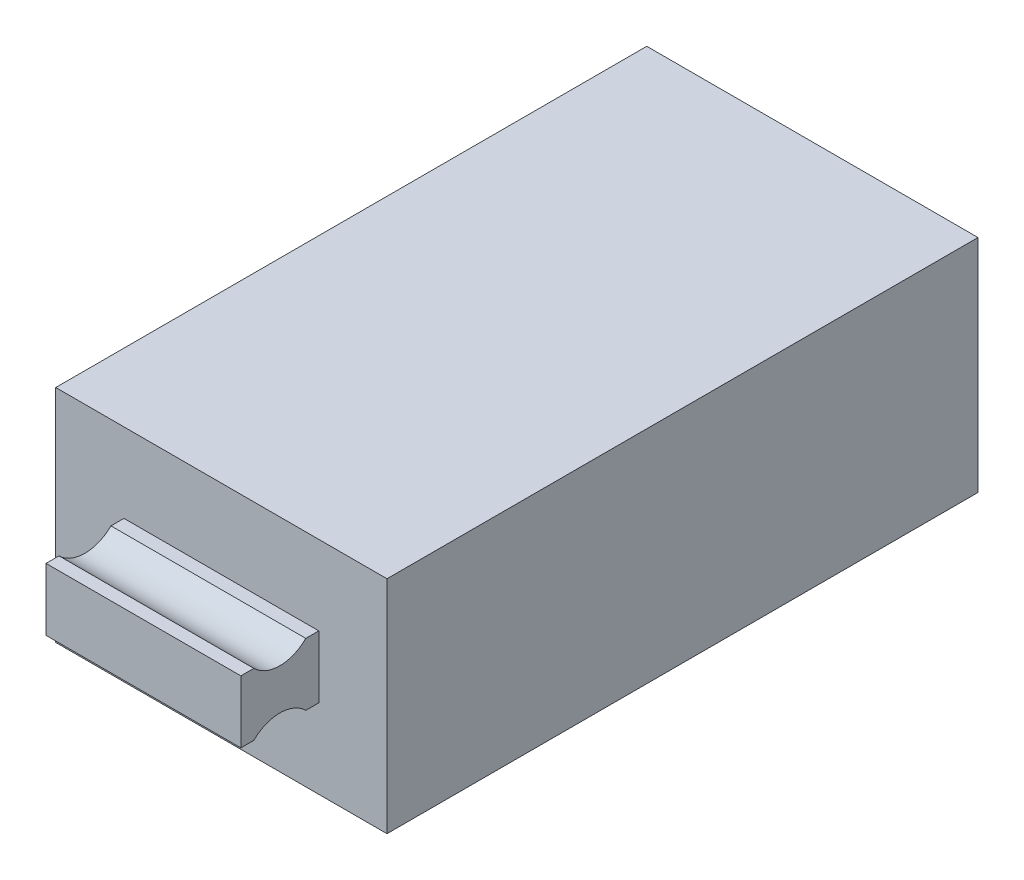
ISO-10303-21;
HEADER;
FILE_DESCRIPTION(('STEP AP214'),'2;1');
FILE_NAME('part.step','',(''),(''),'','','');
FILE_SCHEMA(('AUTOMOTIVE_DESIGN { 1 0 10303 214 1 1 1 1 }'));
ENDSEC;
DATA;
#1=APPLICATION_CONTEXT('core data for automotive mechanical design processes');
#2=APPLICATION_PROTOCOL_DEFINITION('international standard','automotive_design',2000,#1);
#3=PRODUCT_CONTEXT('',#1,'mechanical');
#4=PRODUCT('Part','Part','',(#3));
#5=PRODUCT_RELATED_PRODUCT_CATEGORY('part','',(#4));
#6=PRODUCT_DEFINITION_FORMATION('','',#4);
#7=PRODUCT_DEFINITION_CONTEXT('part definition',#1,'design');
#8=PRODUCT_DEFINITION('design','',#6,#7);
#9=PRODUCT_DEFINITION_SHAPE('','',#8);
#10=(LENGTH_UNIT() NAMED_UNIT(*) SI_UNIT(.MILLI.,.METRE.));
#11=(NAMED_UNIT(*) PLANE_ANGLE_UNIT() SI_UNIT($,.RADIAN.));
#12=(NAMED_UNIT(*) SI_UNIT($,.STERADIAN.) SOLID_ANGLE_UNIT());
#13=UNCERTAINTY_MEASURE_WITH_UNIT(LENGTH_MEASURE(1.E-05),#10,'distance_accuracy_value','');
#14=(GEOMETRIC_REPRESENTATION_CONTEXT(3) GLOBAL_UNCERTAINTY_ASSIGNED_CONTEXT((#13)) GLOBAL_UNIT_ASSIGNED_CONTEXT((#10,
#11,#12)) REPRESENTATION_CONTEXT('',''));
#15=CARTESIAN_POINT('',(0.,0.,0.));
#16=DIRECTION('',(0.,0.,1.));
#17=DIRECTION('',(1.,0.,0.));
#18=AXIS2_PLACEMENT_3D('',#15,#16,#17);
#19=CARTESIAN_POINT('',(0.,0.,91.));
#20=DIRECTION('',(0.,0.,1.));
#21=DIRECTION('',(1.,0.,0.));
#22=AXIS2_PLACEMENT_3D('',#19,#20,#21);
#23=PLANE('',#22);
#24=DIRECTION('',(0.,-1.,0.));
#25=VECTOR('',#24,1.);
#26=CARTESIAN_POINT('',(0.,0.,91.));
#27=LINE('',#26,#25);
#28=CARTESIAN_POINT('',(0.,0.,91.));
#29=VERTEX_POINT('',#28);
#30=CARTESIAN_POINT('',(0.,-34.,91.));
#31=VERTEX_POINT('',#30);
#32=EDGE_CURVE('E196',#29,#31,#27,.T.);
#33=ORIENTED_EDGE('',*,*,#32,.T.);
#34=DIRECTION('',(1.,0.,0.));
#35=VECTOR('',#34,1.);
#36=CARTESIAN_POINT('',(0.,-34.,91.));
#37=LINE('',#36,#35);
#38=CARTESIAN_POINT('',(51.,-34.,91.));
#39=VERTEX_POINT('',#38);
#40=EDGE_CURVE('E83',#31,#39,#37,.T.);
#41=ORIENTED_EDGE('',*,*,#40,.T.);
#42=DIRECTION('',(0.,1.,0.));
#43=VECTOR('',#42,1.);
#44=CARTESIAN_POINT('',(51.,0.,91.));
#45=LINE('',#44,#43);
#46=CARTESIAN_POINT('',(51.,0.,91.));
#47=VERTEX_POINT('',#46);
#48=EDGE_CURVE('E199',#39,#47,#45,.T.);
#49=ORIENTED_EDGE('',*,*,#48,.T.);
#50=DIRECTION('',(-1.,0.,0.));
#51=VECTOR('',#50,1.);
#52=CARTESIAN_POINT('',(0.,0.,91.));
#53=LINE('',#52,#51);
#54=EDGE_CURVE('E52',#47,#29,#53,.T.);
#55=ORIENTED_EDGE('',*,*,#54,.T.);
#56=EDGE_LOOP('',(#33,#41,#49,#55));
#57=FACE_BOUND('',#56,.T.);
#58=DIRECTION('',(-1.,0.,0.));
#59=VECTOR('',#58,1.);
#60=CARTESIAN_POINT('',(52.634249049694,-21.8,91.));
#61=LINE('',#60,#59);
#62=CARTESIAN_POINT('',(40.5,-21.8,91.));
#63=VERTEX_POINT('',#62);
#64=CARTESIAN_POINT('',(10.5,-21.8,91.));
#65=VERTEX_POINT('',#64);
#66=EDGE_CURVE('E153',#63,#65,#61,.T.);
#67=ORIENTED_EDGE('',*,*,#66,.T.);
#68=DIRECTION('',(0.,-1.,0.));
#69=VECTOR('',#68,1.);
#70=CARTESIAN_POINT('',(10.5,-14.,91.));
#71=LINE('',#70,#69);
#72=CARTESIAN_POINT('',(10.5,-12.2,91.));
#73=VERTEX_POINT('',#72);
#74=EDGE_CURVE('E134',#73,#65,#71,.T.);
#75=ORIENTED_EDGE('',*,*,#74,.F.);
#76=DIRECTION('',(-1.,0.,0.));
#77=VECTOR('',#76,1.);
#78=CARTESIAN_POINT('',(52.634249049694,-12.2,91.));
#79=LINE('',#78,#77);
#80=CARTESIAN_POINT('',(40.5,-12.2,91.));
#81=VERTEX_POINT('',#80);
#82=EDGE_CURVE('E172',#81,#73,#79,.T.);
#83=ORIENTED_EDGE('',*,*,#82,.F.);
#84=DIRECTION('',(0.,1.,0.));
#85=VECTOR('',#84,1.);
#86=CARTESIAN_POINT('',(40.5,-14.,91.));
#87=LINE('',#86,#85);
#88=EDGE_CURVE('E146',#63,#81,#87,.T.);
#89=ORIENTED_EDGE('',*,*,#88,.F.);
#90=EDGE_LOOP('',(#67,#75,#83,#89));
#91=FACE_BOUND('',#90,.T.);
#92=ADVANCED_FACE('F35',(#57,#91),#23,.T.);
#93=CARTESIAN_POINT('',(0.,0.,91.));
#94=DIRECTION('',(1.,0.,0.));
#95=DIRECTION('',(0.,1.,0.));
#96=AXIS2_PLACEMENT_3D('',#93,#94,#95);
#97=PLANE('',#96);
#98=DIRECTION('',(0.,-1.,0.));
#99=VECTOR('',#98,1.);
#100=CARTESIAN_POINT('',(0.,0.,0.));
#101=LINE('',#100,#99);
#102=CARTESIAN_POINT('',(0.,0.,0.));
#103=VERTEX_POINT('',#102);
#104=CARTESIAN_POINT('',(0.,-34.,0.));
#105=VERTEX_POINT('',#104);
#106=EDGE_CURVE('E193',#103,#105,#101,.T.);
#107=ORIENTED_EDGE('',*,*,#106,.T.);
#108=DIRECTION('',(0.,0.,-1.));
#109=VECTOR('',#108,1.);
#110=CARTESIAN_POINT('',(0.,-34.,91.));
#111=LINE('',#110,#109);
#112=EDGE_CURVE('E11',#31,#105,#111,.T.);
#113=ORIENTED_EDGE('',*,*,#112,.F.);
#114=ORIENTED_EDGE('',*,*,#32,.F.);
#115=DIRECTION('',(0.,0.,-1.));
#116=VECTOR('',#115,1.);
#117=CARTESIAN_POINT('',(0.,0.,91.));
#118=LINE('',#117,#116);
#119=EDGE_CURVE('E202',#29,#103,#118,.T.);
#120=ORIENTED_EDGE('',*,*,#119,.T.);
#121=EDGE_LOOP('',(#107,#113,#114,#120));
#122=FACE_BOUND('',#121,.T.);
#123=ADVANCED_FACE('F37',(#122),#97,.F.);
#124=CARTESIAN_POINT('',(0.,-34.,91.));
#125=DIRECTION('',(0.,1.,0.));
#126=DIRECTION('',(0.,0.,1.));
#127=AXIS2_PLACEMENT_3D('',#124,#125,#126);
#128=PLANE('',#127);
#129=DIRECTION('',(1.,0.,0.));
#130=VECTOR('',#129,1.);
#131=CARTESIAN_POINT('',(0.,-34.,0.));
#132=LINE('',#131,#130);
#133=CARTESIAN_POINT('',(51.,-34.,0.));
#134=VERTEX_POINT('',#133);
#135=EDGE_CURVE('E205',#105,#134,#132,.T.);
#136=ORIENTED_EDGE('',*,*,#135,.T.);
#137=DIRECTION('',(0.,0.,-1.));
#138=VECTOR('',#137,1.);
#139=CARTESIAN_POINT('',(51.,-34.,91.));
#140=LINE('',#139,#138);
#141=EDGE_CURVE('E44',#39,#134,#140,.T.);
#142=ORIENTED_EDGE('',*,*,#141,.F.);
#143=ORIENTED_EDGE('',*,*,#40,.F.);
#144=ORIENTED_EDGE('',*,*,#112,.T.);
#145=EDGE_LOOP('',(#136,#142,#143,#144));
#146=FACE_BOUND('',#145,.T.);
#147=ADVANCED_FACE('F227',(#146),#128,.F.);
#148=CARTESIAN_POINT('',(51.,0.,91.));
#149=DIRECTION('',(-1.,0.,0.));
#150=DIRECTION('',(0.,-1.,0.));
#151=AXIS2_PLACEMENT_3D('',#148,#149,#150);
#152=PLANE('',#151);
#153=DIRECTION('',(0.,1.,0.));
#154=VECTOR('',#153,1.);
#155=CARTESIAN_POINT('',(51.,0.,0.));
#156=LINE('',#155,#154);
#157=CARTESIAN_POINT('',(51.,0.,0.));
#158=VERTEX_POINT('',#157);
#159=EDGE_CURVE('E70',#134,#158,#156,.T.);
#160=ORIENTED_EDGE('',*,*,#159,.T.);
#161=DIRECTION('',(0.,0.,-1.));
#162=VECTOR('',#161,1.);
#163=CARTESIAN_POINT('',(51.,0.,91.));
#164=LINE('',#163,#162);
#165=EDGE_CURVE('E210',#47,#158,#164,.T.);
#166=ORIENTED_EDGE('',*,*,#165,.F.);
#167=ORIENTED_EDGE('',*,*,#48,.F.);
#168=ORIENTED_EDGE('',*,*,#141,.T.);
#169=EDGE_LOOP('',(#160,#166,#167,#168));
#170=FACE_BOUND('',#169,.T.);
#171=ADVANCED_FACE('F212',(#170),#152,.F.);
#172=CARTESIAN_POINT('',(0.,0.,91.));
#173=DIRECTION('',(0.,-1.,0.));
#174=DIRECTION('',(0.,0.,-1.));
#175=AXIS2_PLACEMENT_3D('',#172,#173,#174);
#176=PLANE('',#175);
#177=DIRECTION('',(-1.,0.,0.));
#178=VECTOR('',#177,1.);
#179=CARTESIAN_POINT('',(0.,0.,0.));
#180=LINE('',#179,#178);
#181=EDGE_CURVE('E76',#158,#103,#180,.T.);
#182=ORIENTED_EDGE('',*,*,#181,.T.);
#183=ORIENTED_EDGE('',*,*,#119,.F.);
#184=ORIENTED_EDGE('',*,*,#54,.F.);
#185=ORIENTED_EDGE('',*,*,#165,.T.);
#186=EDGE_LOOP('',(#182,#183,#184,#185));
#187=FACE_BOUND('',#186,.T.);
#188=ADVANCED_FACE('F219',(#187),#176,.F.);
#189=CARTESIAN_POINT('',(0.,0.,0.));
#190=DIRECTION('',(0.,0.,1.));
#191=DIRECTION('',(1.,0.,0.));
#192=AXIS2_PLACEMENT_3D('',#189,#190,#191);
#193=PLANE('',#192);
#194=ORIENTED_EDGE('',*,*,#106,.F.);
#195=ORIENTED_EDGE('',*,*,#181,.F.);
#196=ORIENTED_EDGE('',*,*,#159,.F.);
#197=ORIENTED_EDGE('',*,*,#135,.F.);
#198=EDGE_LOOP('',(#194,#195,#196,#197));
#199=FACE_BOUND('',#198,.T.);
#200=ADVANCED_FACE('F215',(#199),#193,.F.);
#201=CARTESIAN_POINT('',(10.5,-14.,103.));
#202=DIRECTION('',(1.,0.,0.));
#203=DIRECTION('',(0.,0.,-1.));
#204=AXIS2_PLACEMENT_3D('',#201,#202,#203);
#205=PLANE('',#204);
#206=ORIENTED_EDGE('',*,*,#74,.T.);
#207=DIRECTION('',(0.,0.,1.));
#208=VECTOR('',#207,1.);
#209=CARTESIAN_POINT('',(10.5,-21.8,91.));
#210=LINE('',#209,#208);
#211=CARTESIAN_POINT('',(10.5,-21.8,93.));
#212=VERTEX_POINT('',#211);
#213=EDGE_CURVE('E138',#65,#212,#210,.T.);
#214=ORIENTED_EDGE('',*,*,#213,.T.);
#215=CARTESIAN_POINT('',(10.5,-25.8,97.));
#216=DIRECTION('',(1.,0.,0.));
#217=DIRECTION('',(0.,0.,-1.));
#218=AXIS2_PLACEMENT_3D('',#215,#216,#217);
#219=CIRCLE('',#218,5.65685424949238);
#220=CARTESIAN_POINT('',(10.5,-21.8,101.));
#221=VERTEX_POINT('',#220);
#222=EDGE_CURVE('E157',#212,#221,#219,.T.);
#223=ORIENTED_EDGE('',*,*,#222,.T.);
#224=DIRECTION('',(0.,0.,1.));
#225=VECTOR('',#224,1.);
#226=CARTESIAN_POINT('',(10.5,-21.8,103.));
#227=LINE('',#226,#225);
#228=CARTESIAN_POINT('',(10.5,-21.8,103.));
#229=VERTEX_POINT('',#228);
#230=EDGE_CURVE('E160',#221,#229,#227,.T.);
#231=ORIENTED_EDGE('',*,*,#230,.T.);
#232=DIRECTION('',(0.,-1.,0.));
#233=VECTOR('',#232,1.);
#234=CARTESIAN_POINT('',(10.5,-14.,103.));
#235=LINE('',#234,#233);
#236=CARTESIAN_POINT('',(10.5,-12.2,103.));
#237=VERTEX_POINT('',#236);
#238=EDGE_CURVE('E190',#237,#229,#235,.T.);
#239=ORIENTED_EDGE('',*,*,#238,.F.);
#240=DIRECTION('',(0.,0.,-1.));
#241=VECTOR('',#240,1.);
#242=CARTESIAN_POINT('',(10.5,-12.2,103.));
#243=LINE('',#242,#241);
#244=CARTESIAN_POINT('',(10.5,-12.2,101.));
#245=VERTEX_POINT('',#244);
#246=EDGE_CURVE('E175',#237,#245,#243,.T.);
#247=ORIENTED_EDGE('',*,*,#246,.T.);
#248=CARTESIAN_POINT('',(10.5,-8.2,97.));
#249=DIRECTION('',(1.,0.,0.));
#250=DIRECTION('',(0.,0.,1.));
#251=AXIS2_PLACEMENT_3D('',#248,#249,#250);
#252=CIRCLE('',#251,5.65685424949238);
#253=CARTESIAN_POINT('',(10.5,-12.2,93.));
#254=VERTEX_POINT('',#253);
#255=EDGE_CURVE('E178',#245,#254,#252,.T.);
#256=ORIENTED_EDGE('',*,*,#255,.T.);
#257=DIRECTION('',(0.,0.,-1.));
#258=VECTOR('',#257,1.);
#259=CARTESIAN_POINT('',(10.5,-12.2,91.));
#260=LINE('',#259,#258);
#261=EDGE_CURVE('E141',#254,#73,#260,.T.);
#262=ORIENTED_EDGE('',*,*,#261,.T.);
#263=EDGE_LOOP('',(#206,#214,#223,#231,#239,#247,#256,#262));
#264=FACE_BOUND('',#263,.T.);
#265=ADVANCED_FACE('F136',(#264),#205,.F.);
#266=CARTESIAN_POINT('',(40.5,-14.,103.));
#267=DIRECTION('',(-1.,0.,0.));
#268=DIRECTION('',(0.,0.,1.));
#269=AXIS2_PLACEMENT_3D('',#266,#267,#268);
#270=PLANE('',#269);
#271=ORIENTED_EDGE('',*,*,#88,.T.);
#272=DIRECTION('',(0.,0.,1.));
#273=VECTOR('',#272,1.);
#274=CARTESIAN_POINT('',(40.5,-12.2,91.));
#275=LINE('',#274,#273);
#276=CARTESIAN_POINT('',(40.5,-12.2,93.));
#277=VERTEX_POINT('',#276);
#278=EDGE_CURVE('E147',#81,#277,#275,.T.);
#279=ORIENTED_EDGE('',*,*,#278,.T.);
#280=CARTESIAN_POINT('',(40.5,-8.2,97.));
#281=DIRECTION('',(-1.,0.,0.));
#282=DIRECTION('',(0.,0.,1.));
#283=AXIS2_PLACEMENT_3D('',#280,#281,#282);
#284=CIRCLE('',#283,5.65685424949238);
#285=CARTESIAN_POINT('',(40.5,-12.2,101.));
#286=VERTEX_POINT('',#285);
#287=EDGE_CURVE('E171',#277,#286,#284,.T.);
#288=ORIENTED_EDGE('',*,*,#287,.T.);
#289=DIRECTION('',(0.,0.,1.));
#290=VECTOR('',#289,1.);
#291=CARTESIAN_POINT('',(40.5,-12.2,103.));
#292=LINE('',#291,#290);
#293=CARTESIAN_POINT('',(40.5,-12.2,103.));
#294=VERTEX_POINT('',#293);
#295=EDGE_CURVE('E168',#286,#294,#292,.T.);
#296=ORIENTED_EDGE('',*,*,#295,.T.);
#297=DIRECTION('',(0.,1.,0.));
#298=VECTOR('',#297,1.);
#299=CARTESIAN_POINT('',(40.5,-14.,103.));
#300=LINE('',#299,#298);
#301=CARTESIAN_POINT('',(40.5,-21.8,103.));
#302=VERTEX_POINT('',#301);
#303=EDGE_CURVE('E192',#302,#294,#300,.T.);
#304=ORIENTED_EDGE('',*,*,#303,.F.);
#305=DIRECTION('',(0.,0.,-1.));
#306=VECTOR('',#305,1.);
#307=CARTESIAN_POINT('',(40.5,-21.8,103.));
#308=LINE('',#307,#306);
#309=CARTESIAN_POINT('',(40.5,-21.8,101.));
#310=VERTEX_POINT('',#309);
#311=EDGE_CURVE('E179',#302,#310,#308,.T.);
#312=ORIENTED_EDGE('',*,*,#311,.T.);
#313=CARTESIAN_POINT('',(40.5,-25.8,97.));
#314=DIRECTION('',(-1.,0.,0.));
#315=DIRECTION('',(0.,0.,1.));
#316=AXIS2_PLACEMENT_3D('',#313,#314,#315);
#317=CIRCLE('',#316,5.65685424949238);
#318=CARTESIAN_POINT('',(40.5,-21.8,93.));
#319=VERTEX_POINT('',#318);
#320=EDGE_CURVE('E275',#310,#319,#317,.T.);
#321=ORIENTED_EDGE('',*,*,#320,.T.);
#322=DIRECTION('',(0.,0.,-1.));
#323=VECTOR('',#322,1.);
#324=CARTESIAN_POINT('',(40.5,-21.8,91.));
#325=LINE('',#324,#323);
#326=EDGE_CURVE('E277',#319,#63,#325,.T.);
#327=ORIENTED_EDGE('',*,*,#326,.T.);
#328=EDGE_LOOP('',(#271,#279,#288,#296,#304,#312,#321,#327));
#329=FACE_BOUND('',#328,.T.);
#330=ADVANCED_FACE('F237',(#329),#270,.F.);
#331=CARTESIAN_POINT('',(0.,0.,103.));
#332=DIRECTION('',(0.,0.,1.));
#333=DIRECTION('',(1.,0.,0.));
#334=AXIS2_PLACEMENT_3D('',#331,#332,#333);
#335=PLANE('',#334);
#336=ORIENTED_EDGE('',*,*,#238,.T.);
#337=DIRECTION('',(-1.,0.,0.));
#338=VECTOR('',#337,1.);
#339=CARTESIAN_POINT('',(52.634249049694,-21.8,103.));
#340=LINE('',#339,#338);
#341=EDGE_CURVE('E273',#302,#229,#340,.T.);
#342=ORIENTED_EDGE('',*,*,#341,.F.);
#343=ORIENTED_EDGE('',*,*,#303,.T.);
#344=DIRECTION('',(-1.,0.,0.));
#345=VECTOR('',#344,1.);
#346=CARTESIAN_POINT('',(52.634249049694,-12.2,103.));
#347=LINE('',#346,#345);
#348=EDGE_CURVE('E182',#294,#237,#347,.T.);
#349=ORIENTED_EDGE('',*,*,#348,.T.);
#350=EDGE_LOOP('',(#336,#342,#343,#349));
#351=FACE_BOUND('',#350,.T.);
#352=ADVANCED_FACE('F240',(#351),#335,.T.);
#353=CARTESIAN_POINT('',(52.634249049694,-12.2,91.));
#354=DIRECTION('',(0.,1.,0.));
#355=DIRECTION('',(0.,0.,1.));
#356=AXIS2_PLACEMENT_3D('',#353,#354,#355);
#357=PLANE('',#356);
#358=ORIENTED_EDGE('',*,*,#278,.F.);
#359=ORIENTED_EDGE('',*,*,#82,.T.);
#360=ORIENTED_EDGE('',*,*,#261,.F.);
#361=DIRECTION('',(-1.,0.,0.));
#362=VECTOR('',#361,1.);
#363=CARTESIAN_POINT('',(52.634249049694,-12.2,93.));
#364=LINE('',#363,#362);
#365=EDGE_CURVE('E184',#277,#254,#364,.T.);
#366=ORIENTED_EDGE('',*,*,#365,.F.);
#367=EDGE_LOOP('',(#358,#359,#360,#366));
#368=FACE_BOUND('',#367,.T.);
#369=ADVANCED_FACE('F244',(#368),#357,.T.);
#370=CARTESIAN_POINT('',(52.634249049694,-8.2,97.));
#371=DIRECTION('',(-1.,0.,0.));
#372=DIRECTION('',(0.,0.,1.));
#373=AXIS2_PLACEMENT_3D('',#370,#371,#372);
#374=CYLINDRICAL_SURFACE('',#373,5.65685424949238);
#375=ORIENTED_EDGE('',*,*,#287,.F.);
#376=ORIENTED_EDGE('',*,*,#365,.T.);
#377=ORIENTED_EDGE('',*,*,#255,.F.);
#378=DIRECTION('',(-1.,0.,0.));
#379=VECTOR('',#378,1.);
#380=CARTESIAN_POINT('',(52.634249049694,-12.2,101.));
#381=LINE('',#380,#379);
#382=EDGE_CURVE('E186',#286,#245,#381,.T.);
#383=ORIENTED_EDGE('',*,*,#382,.F.);
#384=EDGE_LOOP('',(#375,#376,#377,#383));
#385=FACE_BOUND('',#384,.T.);
#386=ADVANCED_FACE('F250',(#385),#374,.F.);
#387=CARTESIAN_POINT('',(52.634249049694,-12.2,103.));
#388=DIRECTION('',(0.,1.,0.));
#389=DIRECTION('',(0.,0.,1.));
#390=AXIS2_PLACEMENT_3D('',#387,#388,#389);
#391=PLANE('',#390);
#392=ORIENTED_EDGE('',*,*,#295,.F.);
#393=ORIENTED_EDGE('',*,*,#382,.T.);
#394=ORIENTED_EDGE('',*,*,#246,.F.);
#395=ORIENTED_EDGE('',*,*,#348,.F.);
#396=EDGE_LOOP('',(#392,#393,#394,#395));
#397=FACE_BOUND('',#396,.T.);
#398=ADVANCED_FACE('F246',(#397),#391,.T.);
#399=CARTESIAN_POINT('',(52.634249049694,-21.8,103.));
#400=DIRECTION('',(0.,-1.,0.));
#401=DIRECTION('',(0.,0.,-1.));
#402=AXIS2_PLACEMENT_3D('',#399,#400,#401);
#403=PLANE('',#402);
#404=ORIENTED_EDGE('',*,*,#311,.F.);
#405=ORIENTED_EDGE('',*,*,#341,.T.);
#406=ORIENTED_EDGE('',*,*,#230,.F.);
#407=DIRECTION('',(-1.,0.,0.));
#408=VECTOR('',#407,1.);
#409=CARTESIAN_POINT('',(52.634249049694,-21.8,101.));
#410=LINE('',#409,#408);
#411=EDGE_CURVE('E162',#310,#221,#410,.T.);
#412=ORIENTED_EDGE('',*,*,#411,.F.);
#413=EDGE_LOOP('',(#404,#405,#406,#412));
#414=FACE_BOUND('',#413,.T.);
#415=ADVANCED_FACE('F249',(#414),#403,.T.);
#416=CARTESIAN_POINT('',(52.634249049694,-25.8,97.));
#417=DIRECTION('',(-1.,0.,0.));
#418=DIRECTION('',(0.,0.,1.));
#419=AXIS2_PLACEMENT_3D('',#416,#417,#418);
#420=CYLINDRICAL_SURFACE('',#419,5.65685424949238);
#421=ORIENTED_EDGE('',*,*,#320,.F.);
#422=ORIENTED_EDGE('',*,*,#411,.T.);
#423=ORIENTED_EDGE('',*,*,#222,.F.);
#424=DIRECTION('',(-1.,0.,0.));
#425=VECTOR('',#424,1.);
#426=CARTESIAN_POINT('',(52.634249049694,-21.8,93.));
#427=LINE('',#426,#425);
#428=EDGE_CURVE('E155',#319,#212,#427,.T.);
#429=ORIENTED_EDGE('',*,*,#428,.F.);
#430=EDGE_LOOP('',(#421,#422,#423,#429));
#431=FACE_BOUND('',#430,.T.);
#432=ADVANCED_FACE('F260',(#431),#420,.F.);
#433=CARTESIAN_POINT('',(52.634249049694,-21.8,91.));
#434=DIRECTION('',(0.,-1.,0.));
#435=DIRECTION('',(0.,0.,-1.));
#436=AXIS2_PLACEMENT_3D('',#433,#434,#435);
#437=PLANE('',#436);
#438=ORIENTED_EDGE('',*,*,#326,.F.);
#439=ORIENTED_EDGE('',*,*,#428,.T.);
#440=ORIENTED_EDGE('',*,*,#213,.F.);
#441=ORIENTED_EDGE('',*,*,#66,.F.);
#442=EDGE_LOOP('',(#438,#439,#440,#441));
#443=FACE_BOUND('',#442,.T.);
#444=ADVANCED_FACE('F152',(#443),#437,.T.);
#445=CLOSED_SHELL('',(#92,#123,#147,#171,#188,#200,#265,#330,#352,#369,#386,#398,#415,#432,#444));
#446=MANIFOLD_SOLID_BREP('B2',#445);
#447=ADVANCED_BREP_SHAPE_REPRESENTATION('',(#18,#446),#14);
#448=SHAPE_DEFINITION_REPRESENTATION(#9,#447);
ENDSEC;
END-ISO-10303-21;
